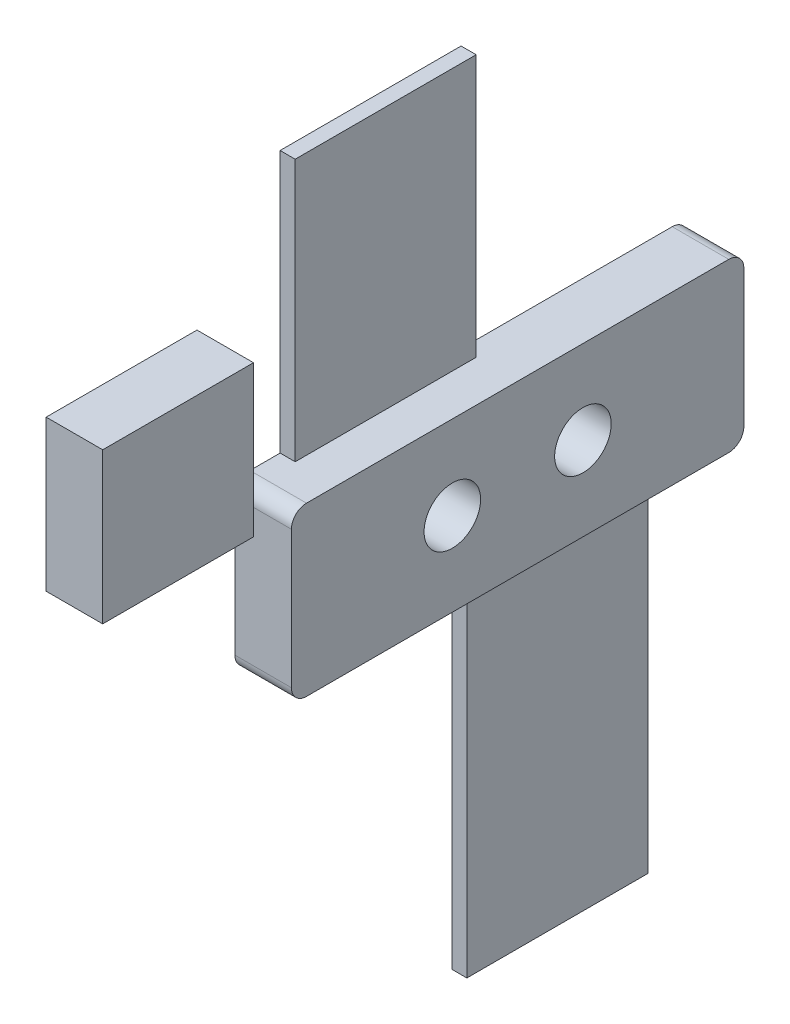
ISO-10303-21;
HEADER;
FILE_DESCRIPTION(('STEP AP214'),'2;1');
FILE_NAME('part.step','',(''),(''),'','','');
FILE_SCHEMA(('AUTOMOTIVE_DESIGN { 1 0 10303 214 1 1 1 1 }'));
ENDSEC;
DATA;
#1=APPLICATION_CONTEXT('core data for automotive mechanical design processes');
#2=APPLICATION_PROTOCOL_DEFINITION('international standard','automotive_design',2000,#1);
#3=PRODUCT_CONTEXT('',#1,'mechanical');
#4=PRODUCT('Part','Part','',(#3));
#5=PRODUCT_RELATED_PRODUCT_CATEGORY('part','',(#4));
#6=PRODUCT_DEFINITION_FORMATION('','',#4);
#7=PRODUCT_DEFINITION_CONTEXT('part definition',#1,'design');
#8=PRODUCT_DEFINITION('design','',#6,#7);
#9=PRODUCT_DEFINITION_SHAPE('','',#8);
#10=(LENGTH_UNIT() NAMED_UNIT(*) SI_UNIT(.MILLI.,.METRE.));
#11=(NAMED_UNIT(*) PLANE_ANGLE_UNIT() SI_UNIT($,.RADIAN.));
#12=(NAMED_UNIT(*) SI_UNIT($,.STERADIAN.) SOLID_ANGLE_UNIT());
#13=UNCERTAINTY_MEASURE_WITH_UNIT(LENGTH_MEASURE(1.E-05),#10,'distance_accuracy_value','');
#14=(GEOMETRIC_REPRESENTATION_CONTEXT(3) GLOBAL_UNCERTAINTY_ASSIGNED_CONTEXT((#13)) GLOBAL_UNIT_ASSIGNED_CONTEXT((#10,
#11,#12)) REPRESENTATION_CONTEXT('',''));
#15=CARTESIAN_POINT('',(0.,0.,0.));
#16=DIRECTION('',(0.,0.,1.));
#17=DIRECTION('',(1.,0.,0.));
#18=AXIS2_PLACEMENT_3D('',#15,#16,#17);
#19=CARTESIAN_POINT('',(22.7230122421383,19.5204476458362,34.9411001903851));
#20=DIRECTION('',(0.,0.,1.));
#21=DIRECTION('',(1.,0.,0.));
#22=AXIS2_PLACEMENT_3D('',#19,#20,#21);
#23=PLANE('',#22);
#24=DIRECTION('',(0.,-1.,0.));
#25=VECTOR('',#24,1.);
#26=CARTESIAN_POINT('',(4.7625,19.5204476458362,34.9411001903851));
#27=LINE('',#26,#25);
#28=CARTESIAN_POINT('',(4.7625,19.5204476458362,34.9411001903851));
#29=VERTEX_POINT('',#28);
#30=CARTESIAN_POINT('',(4.7625,6.82044764583623,34.9411001903851));
#31=VERTEX_POINT('',#30);
#32=EDGE_CURVE('E52',#29,#31,#27,.T.);
#33=ORIENTED_EDGE('',*,*,#32,.F.);
#34=DIRECTION('',(-1.,0.,0.));
#35=VECTOR('',#34,1.);
#36=CARTESIAN_POINT('',(22.7230122421383,19.5204476458362,34.9411001903851));
#37=LINE('',#36,#35);
#38=CARTESIAN_POINT('',(0.,19.5204476458362,34.9411001903851));
#39=VERTEX_POINT('',#38);
#40=EDGE_CURVE('E80',#29,#39,#37,.T.);
#41=ORIENTED_EDGE('',*,*,#40,.T.);
#42=DIRECTION('',(0.,1.,0.));
#43=VECTOR('',#42,1.);
#44=CARTESIAN_POINT('',(0.,19.5204476458362,34.9411001903851));
#45=LINE('',#44,#43);
#46=CARTESIAN_POINT('',(0.,6.82044764583623,34.9411001903851));
#47=VERTEX_POINT('',#46);
#48=EDGE_CURVE('E84',#47,#39,#45,.T.);
#49=ORIENTED_EDGE('',*,*,#48,.F.);
#50=DIRECTION('',(-1.,0.,0.));
#51=VECTOR('',#50,1.);
#52=CARTESIAN_POINT('',(22.7230122421383,6.82044764583623,34.9411001903851));
#53=LINE('',#52,#51);
#54=EDGE_CURVE('E107',#31,#47,#53,.T.);
#55=ORIENTED_EDGE('',*,*,#54,.F.);
#56=EDGE_LOOP('',(#33,#41,#49,#55));
#57=FACE_BOUND('',#56,.T.);
#58=ADVANCED_FACE('F44',(#57),#23,.T.);
#59=CARTESIAN_POINT('',(22.7230122421383,6.82044764583623,34.9411001903851));
#60=DIRECTION('',(0.,-1.,0.));
#61=DIRECTION('',(0.,0.,-1.));
#62=AXIS2_PLACEMENT_3D('',#59,#60,#61);
#63=PLANE('',#62);
#64=DIRECTION('',(0.,0.,-1.));
#65=VECTOR('',#64,1.);
#66=CARTESIAN_POINT('',(4.7625,6.82044764583623,34.9411001903851));
#67=LINE('',#66,#65);
#68=CARTESIAN_POINT('',(4.7625,6.82044764583623,22.2411001903851));
#69=VERTEX_POINT('',#68);
#70=EDGE_CURVE('E58',#31,#69,#67,.T.);
#71=ORIENTED_EDGE('',*,*,#70,.F.);
#72=ORIENTED_EDGE('',*,*,#54,.T.);
#73=DIRECTION('',(0.,0.,1.));
#74=VECTOR('',#73,1.);
#75=CARTESIAN_POINT('',(0.,6.82044764583623,34.9411001903851));
#76=LINE('',#75,#74);
#77=CARTESIAN_POINT('',(0.,6.82044764583623,22.2411001903851));
#78=VERTEX_POINT('',#77);
#79=EDGE_CURVE('E89',#78,#47,#76,.T.);
#80=ORIENTED_EDGE('',*,*,#79,.F.);
#81=DIRECTION('',(-1.,0.,0.));
#82=VECTOR('',#81,1.);
#83=CARTESIAN_POINT('',(22.7230122421383,6.82044764583623,22.2411001903851));
#84=LINE('',#83,#82);
#85=EDGE_CURVE('E110',#69,#78,#84,.T.);
#86=ORIENTED_EDGE('',*,*,#85,.F.);
#87=EDGE_LOOP('',(#71,#72,#80,#86));
#88=FACE_BOUND('',#87,.T.);
#89=ADVANCED_FACE('F116',(#88),#63,.T.);
#90=CARTESIAN_POINT('',(22.7230122421383,19.5204476458362,22.2411001903851));
#91=DIRECTION('',(0.,0.,-1.));
#92=DIRECTION('',(0.,1.,0.));
#93=AXIS2_PLACEMENT_3D('',#90,#91,#92);
#94=PLANE('',#93);
#95=DIRECTION('',(0.,1.,0.));
#96=VECTOR('',#95,1.);
#97=CARTESIAN_POINT('',(4.7625,19.5204476458362,22.2411001903851));
#98=LINE('',#97,#96);
#99=CARTESIAN_POINT('',(4.7625,19.5204476458362,22.2411001903851));
#100=VERTEX_POINT('',#99);
#101=EDGE_CURVE('E109',#69,#100,#98,.T.);
#102=ORIENTED_EDGE('',*,*,#101,.F.);
#103=ORIENTED_EDGE('',*,*,#85,.T.);
#104=DIRECTION('',(0.,-1.,0.));
#105=VECTOR('',#104,1.);
#106=CARTESIAN_POINT('',(0.,19.5204476458362,22.2411001903851));
#107=LINE('',#106,#105);
#108=CARTESIAN_POINT('',(0.,19.5204476458362,22.2411001903851));
#109=VERTEX_POINT('',#108);
#110=EDGE_CURVE('E97',#109,#78,#107,.T.);
#111=ORIENTED_EDGE('',*,*,#110,.F.);
#112=DIRECTION('',(-1.,0.,0.));
#113=VECTOR('',#112,1.);
#114=CARTESIAN_POINT('',(22.7230122421383,19.5204476458362,22.2411001903851));
#115=LINE('',#114,#113);
#116=EDGE_CURVE('E88',#100,#109,#115,.T.);
#117=ORIENTED_EDGE('',*,*,#116,.F.);
#118=EDGE_LOOP('',(#102,#103,#111,#117));
#119=FACE_BOUND('',#118,.T.);
#120=ADVANCED_FACE('F114',(#119),#94,.T.);
#121=CARTESIAN_POINT('',(22.7230122421383,19.5204476458362,34.9411001903851));
#122=DIRECTION('',(0.,1.,0.));
#123=DIRECTION('',(0.,0.,1.));
#124=AXIS2_PLACEMENT_3D('',#121,#122,#123);
#125=PLANE('',#124);
#126=DIRECTION('',(0.,0.,1.));
#127=VECTOR('',#126,1.);
#128=CARTESIAN_POINT('',(4.7625,19.5204476458362,34.9411001903851));
#129=LINE('',#128,#127);
#130=EDGE_CURVE('E12',#100,#29,#129,.T.);
#131=ORIENTED_EDGE('',*,*,#130,.F.);
#132=ORIENTED_EDGE('',*,*,#116,.T.);
#133=DIRECTION('',(0.,0.,-1.));
#134=VECTOR('',#133,1.);
#135=CARTESIAN_POINT('',(0.,19.5204476458362,34.9411001903851));
#136=LINE('',#135,#134);
#137=EDGE_CURVE('E91',#39,#109,#136,.T.);
#138=ORIENTED_EDGE('',*,*,#137,.F.);
#139=ORIENTED_EDGE('',*,*,#40,.F.);
#140=EDGE_LOOP('',(#131,#132,#138,#139));
#141=FACE_BOUND('',#140,.T.);
#142=ADVANCED_FACE('F92',(#141),#125,.T.);
#143=CARTESIAN_POINT('',(0.,0.,0.));
#144=DIRECTION('',(1.,0.,0.));
#145=DIRECTION('',(0.,0.,-1.));
#146=AXIS2_PLACEMENT_3D('',#143,#144,#145);
#147=PLANE('',#146);
#148=ORIENTED_EDGE('',*,*,#48,.T.);
#149=ORIENTED_EDGE('',*,*,#137,.T.);
#150=ORIENTED_EDGE('',*,*,#110,.T.);
#151=ORIENTED_EDGE('',*,*,#79,.T.);
#152=EDGE_LOOP('',(#148,#149,#150,#151));
#153=FACE_BOUND('',#152,.T.);
#154=ADVANCED_FACE('F99',(#153),#147,.F.);
#155=CARTESIAN_POINT('',(4.7625,0.,0.));
#156=DIRECTION('',(-1.,0.,0.));
#157=DIRECTION('',(0.,0.,1.));
#158=AXIS2_PLACEMENT_3D('',#155,#156,#157);
#159=PLANE('',#158);
#160=ORIENTED_EDGE('',*,*,#32,.T.);
#161=ORIENTED_EDGE('',*,*,#70,.T.);
#162=ORIENTED_EDGE('',*,*,#101,.T.);
#163=ORIENTED_EDGE('',*,*,#130,.T.);
#164=EDGE_LOOP('',(#160,#161,#162,#163));
#165=FACE_BOUND('',#164,.T.);
#166=ADVANCED_FACE('F118',(#165),#159,.F.);
#167=CLOSED_SHELL('',(#58,#89,#120,#142,#154,#166));
#168=MANIFOLD_SOLID_BREP('B2',#167);
#169=CARTESIAN_POINT('',(4.7625,-7.0485,19.05));
#170=DIRECTION('',(0.,0.,-1.));
#171=DIRECTION('',(-1.,0.,0.));
#172=AXIS2_PLACEMENT_3D('',#169,#170,#171);
#173=PLANE('',#172);
#174=DIRECTION('',(0.,-1.,0.));
#175=VECTOR('',#174,1.);
#176=CARTESIAN_POINT('',(4.7625,-7.0485,19.05));
#177=LINE('',#176,#175);
#178=CARTESIAN_POINT('',(4.7625,5.7785,19.05));
#179=VERTEX_POINT('',#178);
#180=CARTESIAN_POINT('',(4.7625,-5.7785,19.05));
#181=VERTEX_POINT('',#180);
#182=EDGE_CURVE('E355',#179,#181,#177,.T.);
#183=ORIENTED_EDGE('',*,*,#182,.F.);
#184=DIRECTION('',(-1.,0.,0.));
#185=VECTOR('',#184,1.);
#186=CARTESIAN_POINT('',(4.7625,5.7785,19.05));
#187=LINE('',#186,#185);
#188=CARTESIAN_POINT('',(0.,5.7785,19.05));
#189=VERTEX_POINT('',#188);
#190=EDGE_CURVE('E380',#179,#189,#187,.T.);
#191=ORIENTED_EDGE('',*,*,#190,.T.);
#192=DIRECTION('',(0.,-1.,0.));
#193=VECTOR('',#192,1.);
#194=CARTESIAN_POINT('',(0.,-7.0485,19.05));
#195=LINE('',#194,#193);
#196=CARTESIAN_POINT('',(0.,-5.7785,19.05));
#197=VERTEX_POINT('',#196);
#198=EDGE_CURVE('E350',#189,#197,#195,.T.);
#199=ORIENTED_EDGE('',*,*,#198,.T.);
#200=DIRECTION('',(-1.,0.,0.));
#201=VECTOR('',#200,1.);
#202=CARTESIAN_POINT('',(4.7625,-5.7785,19.05));
#203=LINE('',#202,#201);
#204=EDGE_CURVE('E368',#197,#181,#203,.F.);
#205=ORIENTED_EDGE('',*,*,#204,.T.);
#206=EDGE_LOOP('',(#183,#191,#199,#205));
#207=FACE_BOUND('',#206,.T.);
#208=ADVANCED_FACE('F167',(#207),#173,.F.);
#209=CARTESIAN_POINT('',(4.7625,-7.0485,19.05));
#210=DIRECTION('',(0.,1.,0.));
#211=DIRECTION('',(0.,0.,1.));
#212=AXIS2_PLACEMENT_3D('',#209,#210,#211);
#213=PLANE('',#212);
#214=DIRECTION('',(0.,0.,-1.));
#215=VECTOR('',#214,1.);
#216=CARTESIAN_POINT('',(0.,-7.0485,19.05));
#217=LINE('',#216,#215);
#218=CARTESIAN_POINT('',(0.,-7.0485,17.78));
#219=VERTEX_POINT('',#218);
#220=CARTESIAN_POINT('',(0.,-7.0485,0.78331789402027));
#221=VERTEX_POINT('',#220);
#222=EDGE_CURVE('E372',#219,#221,#217,.T.);
#223=ORIENTED_EDGE('',*,*,#222,.T.);
#224=DIRECTION('',(-1.,0.,0.));
#225=VECTOR('',#224,1.);
#226=CARTESIAN_POINT('',(1.27,-7.0485,0.783317894020271));
#227=LINE('',#226,#225);
#228=CARTESIAN_POINT('',(1.27,-7.0485,0.783317894020277));
#229=VERTEX_POINT('',#228);
#230=EDGE_CURVE('E187',#229,#221,#227,.T.);
#231=ORIENTED_EDGE('',*,*,#230,.F.);
#232=DIRECTION('',(0.,0.,-1.));
#233=VECTOR('',#232,1.);
#234=CARTESIAN_POINT('',(1.27,-7.0485,0.783317894020271));
#235=LINE('',#234,#233);
#236=CARTESIAN_POINT('',(1.27,-7.0485,-14.4566821059797));
#237=VERTEX_POINT('',#236);
#238=EDGE_CURVE('E182',#229,#237,#235,.T.);
#239=ORIENTED_EDGE('',*,*,#238,.T.);
#240=DIRECTION('',(-1.,0.,0.));
#241=VECTOR('',#240,1.);
#242=CARTESIAN_POINT('',(1.27,-7.0485,-14.4566821059797));
#243=LINE('',#242,#241);
#244=CARTESIAN_POINT('',(0.,-7.0485,-14.4566821059797));
#245=VERTEX_POINT('',#244);
#246=EDGE_CURVE('E289',#237,#245,#243,.T.);
#247=ORIENTED_EDGE('',*,*,#246,.T.);
#248=CARTESIAN_POINT('',(0.,-7.0485,-17.78));
#249=VERTEX_POINT('',#248);
#250=EDGE_CURVE('E371',#245,#249,#217,.T.);
#251=ORIENTED_EDGE('',*,*,#250,.T.);
#252=DIRECTION('',(-1.,0.,0.));
#253=VECTOR('',#252,1.);
#254=CARTESIAN_POINT('',(4.7625,-7.0485,-17.78));
#255=LINE('',#254,#253);
#256=CARTESIAN_POINT('',(4.7625,-7.0485,-17.78));
#257=VERTEX_POINT('',#256);
#258=EDGE_CURVE('E42',#249,#257,#255,.F.);
#259=ORIENTED_EDGE('',*,*,#258,.T.);
#260=DIRECTION('',(0.,0.,-1.));
#261=VECTOR('',#260,1.);
#262=CARTESIAN_POINT('',(4.7625,-7.0485,19.05));
#263=LINE('',#262,#261);
#264=CARTESIAN_POINT('',(4.7625,-7.0485,17.78));
#265=VERTEX_POINT('',#264);
#266=EDGE_CURVE('E358',#265,#257,#263,.T.);
#267=ORIENTED_EDGE('',*,*,#266,.F.);
#268=DIRECTION('',(-1.,0.,0.));
#269=VECTOR('',#268,1.);
#270=CARTESIAN_POINT('',(4.7625,-7.0485,17.78));
#271=LINE('',#270,#269);
#272=EDGE_CURVE('E175',#265,#219,#271,.T.);
#273=ORIENTED_EDGE('',*,*,#272,.T.);
#274=EDGE_LOOP('',(#223,#231,#239,#247,#251,#259,#267,#273));
#275=FACE_BOUND('',#274,.T.);
#276=ADVANCED_FACE('F414',(#275),#213,.F.);
#277=CARTESIAN_POINT('',(4.7625,-7.0485,-19.05));
#278=DIRECTION('',(0.,0.,1.));
#279=DIRECTION('',(1.,0.,0.));
#280=AXIS2_PLACEMENT_3D('',#277,#278,#279);
#281=PLANE('',#280);
#282=DIRECTION('',(0.,1.,0.));
#283=VECTOR('',#282,1.);
#284=CARTESIAN_POINT('',(0.,-7.0485,-19.05));
#285=LINE('',#284,#283);
#286=CARTESIAN_POINT('',(0.,-5.7785,-19.05));
#287=VERTEX_POINT('',#286);
#288=CARTESIAN_POINT('',(0.,5.7785,-19.05));
#289=VERTEX_POINT('',#288);
#290=EDGE_CURVE('E374',#287,#289,#285,.T.);
#291=ORIENTED_EDGE('',*,*,#290,.T.);
#292=DIRECTION('',(-1.,0.,0.));
#293=VECTOR('',#292,1.);
#294=CARTESIAN_POINT('',(4.7625,5.7785,-19.05));
#295=LINE('',#294,#293);
#296=CARTESIAN_POINT('',(4.7625,5.7785,-19.05));
#297=VERTEX_POINT('',#296);
#298=EDGE_CURVE('E409',#289,#297,#295,.F.);
#299=ORIENTED_EDGE('',*,*,#298,.T.);
#300=DIRECTION('',(0.,1.,0.));
#301=VECTOR('',#300,1.);
#302=CARTESIAN_POINT('',(4.7625,-7.0485,-19.05));
#303=LINE('',#302,#301);
#304=CARTESIAN_POINT('',(4.7625,-5.7785,-19.05));
#305=VERTEX_POINT('',#304);
#306=EDGE_CURVE('E362',#305,#297,#303,.T.);
#307=ORIENTED_EDGE('',*,*,#306,.F.);
#308=DIRECTION('',(-1.,0.,0.));
#309=VECTOR('',#308,1.);
#310=CARTESIAN_POINT('',(4.7625,-5.7785,-19.05));
#311=LINE('',#310,#309);
#312=EDGE_CURVE('E406',#305,#287,#311,.T.);
#313=ORIENTED_EDGE('',*,*,#312,.T.);
#314=EDGE_LOOP('',(#291,#299,#307,#313));
#315=FACE_BOUND('',#314,.T.);
#316=ADVANCED_FACE('F442',(#315),#281,.F.);
#317=CARTESIAN_POINT('',(4.7625,7.0485,19.05));
#318=DIRECTION('',(0.,-1.,0.));
#319=DIRECTION('',(0.,0.,-1.));
#320=AXIS2_PLACEMENT_3D('',#317,#318,#319);
#321=PLANE('',#320);
#322=DIRECTION('',(0.,0.,1.));
#323=VECTOR('',#322,1.);
#324=CARTESIAN_POINT('',(1.27,7.0485,15.24));
#325=LINE('',#324,#323);
#326=CARTESIAN_POINT('',(1.27,7.0485,0.));
#327=VERTEX_POINT('',#326);
#328=CARTESIAN_POINT('',(1.27,7.0485,15.24));
#329=VERTEX_POINT('',#328);
#330=EDGE_CURVE('E323',#327,#329,#325,.T.);
#331=ORIENTED_EDGE('',*,*,#330,.T.);
#332=DIRECTION('',(-1.,0.,0.));
#333=VECTOR('',#332,1.);
#334=CARTESIAN_POINT('',(1.27,7.0485,15.24));
#335=LINE('',#334,#333);
#336=CARTESIAN_POINT('',(0.,7.0485,15.24));
#337=VERTEX_POINT('',#336);
#338=EDGE_CURVE('E333',#329,#337,#335,.T.);
#339=ORIENTED_EDGE('',*,*,#338,.T.);
#340=DIRECTION('',(0.,0.,1.));
#341=VECTOR('',#340,1.);
#342=CARTESIAN_POINT('',(0.,7.0485,19.05));
#343=LINE('',#342,#341);
#344=CARTESIAN_POINT('',(0.,7.0485,17.78));
#345=VERTEX_POINT('',#344);
#346=EDGE_CURVE('E377',#337,#345,#343,.T.);
#347=ORIENTED_EDGE('',*,*,#346,.T.);
#348=DIRECTION('',(-1.,0.,0.));
#349=VECTOR('',#348,1.);
#350=CARTESIAN_POINT('',(4.7625,7.0485,17.78));
#351=LINE('',#350,#349);
#352=CARTESIAN_POINT('',(4.7625,7.0485,17.78));
#353=VERTEX_POINT('',#352);
#354=EDGE_CURVE('E396',#345,#353,#351,.F.);
#355=ORIENTED_EDGE('',*,*,#354,.T.);
#356=DIRECTION('',(0.,0.,1.));
#357=VECTOR('',#356,1.);
#358=CARTESIAN_POINT('',(4.7625,7.0485,19.05));
#359=LINE('',#358,#357);
#360=CARTESIAN_POINT('',(4.7625,7.0485,-17.78));
#361=VERTEX_POINT('',#360);
#362=EDGE_CURVE('E365',#361,#353,#359,.T.);
#363=ORIENTED_EDGE('',*,*,#362,.F.);
#364=DIRECTION('',(-1.,0.,0.));
#365=VECTOR('',#364,1.);
#366=CARTESIAN_POINT('',(4.7625,7.0485,-17.78));
#367=LINE('',#366,#365);
#368=CARTESIAN_POINT('',(0.,7.0485,-17.78));
#369=VERTEX_POINT('',#368);
#370=EDGE_CURVE('E393',#361,#369,#367,.T.);
#371=ORIENTED_EDGE('',*,*,#370,.T.);
#372=CARTESIAN_POINT('',(0.,7.0485,0.));
#373=VERTEX_POINT('',#372);
#374=EDGE_CURVE('E359',#369,#373,#343,.T.);
#375=ORIENTED_EDGE('',*,*,#374,.T.);
#376=DIRECTION('',(-1.,0.,0.));
#377=VECTOR('',#376,1.);
#378=CARTESIAN_POINT('',(1.27,7.0485,0.));
#379=LINE('',#378,#377);
#380=EDGE_CURVE('E337',#327,#373,#379,.T.);
#381=ORIENTED_EDGE('',*,*,#380,.F.);
#382=EDGE_LOOP('',(#331,#339,#347,#355,#363,#371,#375,#381));
#383=FACE_BOUND('',#382,.T.);
#384=ADVANCED_FACE('F475',(#383),#321,.F.);
#385=CARTESIAN_POINT('',(4.7625,0.,0.));
#386=DIRECTION('',(-1.,0.,0.));
#387=DIRECTION('',(0.,0.,1.));
#388=AXIS2_PLACEMENT_3D('',#385,#386,#387);
#389=PLANE('',#388);
#390=CARTESIAN_POINT('',(4.7625,0.,5.4991));
#391=DIRECTION('',(1.,0.,0.));
#392=DIRECTION('',(0.,0.,-1.));
#393=AXIS2_PLACEMENT_3D('',#390,#391,#392);
#394=CIRCLE('',#393,2.38125);
#395=CARTESIAN_POINT('',(4.7625,0.,3.11785));
#396=VERTEX_POINT('',#395);
#397=EDGE_CURVE('E343',#396,#396,#394,.T.);
#398=ORIENTED_EDGE('',*,*,#397,.F.);
#399=EDGE_LOOP('',(#398));
#400=FACE_BOUND('',#399,.T.);
#401=CARTESIAN_POINT('',(4.7625,0.,-5.4991));
#402=DIRECTION('',(1.,0.,0.));
#403=DIRECTION('',(0.,0.,-1.));
#404=AXIS2_PLACEMENT_3D('',#401,#402,#403);
#405=CIRCLE('',#404,2.38125);
#406=CARTESIAN_POINT('',(4.7625,0.,-7.88035));
#407=VERTEX_POINT('',#406);
#408=EDGE_CURVE('E336',#407,#407,#405,.T.);
#409=ORIENTED_EDGE('',*,*,#408,.F.);
#410=EDGE_LOOP('',(#409));
#411=FACE_BOUND('',#410,.T.);
#412=ORIENTED_EDGE('',*,*,#362,.T.);
#413=CARTESIAN_POINT('',(4.7625,5.7785,17.78));
#414=DIRECTION('',(-1.,0.,0.));
#415=DIRECTION('',(0.,0.,1.));
#416=AXIS2_PLACEMENT_3D('',#413,#414,#415);
#417=CIRCLE('',#416,1.27);
#418=EDGE_CURVE('E404',#353,#179,#417,.F.);
#419=ORIENTED_EDGE('',*,*,#418,.T.);
#420=ORIENTED_EDGE('',*,*,#182,.T.);
#421=CARTESIAN_POINT('',(4.7625,-5.7785,17.78));
#422=DIRECTION('',(-1.,0.,0.));
#423=DIRECTION('',(0.,0.,1.));
#424=AXIS2_PLACEMENT_3D('',#421,#422,#423);
#425=CIRCLE('',#424,1.27);
#426=EDGE_CURVE('E398',#181,#265,#425,.F.);
#427=ORIENTED_EDGE('',*,*,#426,.T.);
#428=ORIENTED_EDGE('',*,*,#266,.T.);
#429=CARTESIAN_POINT('',(4.7625,-5.7785,-17.78));
#430=DIRECTION('',(-1.,0.,0.));
#431=DIRECTION('',(0.,0.,1.));
#432=AXIS2_PLACEMENT_3D('',#429,#430,#431);
#433=CIRCLE('',#432,1.27);
#434=EDGE_CURVE('E400',#257,#305,#433,.F.);
#435=ORIENTED_EDGE('',*,*,#434,.T.);
#436=ORIENTED_EDGE('',*,*,#306,.T.);
#437=CARTESIAN_POINT('',(4.7625,5.7785,-17.78));
#438=DIRECTION('',(-1.,0.,0.));
#439=DIRECTION('',(0.,0.,1.));
#440=AXIS2_PLACEMENT_3D('',#437,#438,#439);
#441=CIRCLE('',#440,1.27);
#442=EDGE_CURVE('E402',#297,#361,#441,.F.);
#443=ORIENTED_EDGE('',*,*,#442,.T.);
#444=EDGE_LOOP('',(#412,#419,#420,#427,#428,#435,#436,#443));
#445=FACE_BOUND('',#444,.T.);
#446=ADVANCED_FACE('F466',(#400,#411,#445),#389,.F.);
#447=CARTESIAN_POINT('',(0.,0.,0.));
#448=DIRECTION('',(-1.,0.,0.));
#449=DIRECTION('',(0.,0.,1.));
#450=AXIS2_PLACEMENT_3D('',#447,#448,#449);
#451=PLANE('',#450);
#452=CARTESIAN_POINT('',(0.,0.,5.4991));
#453=DIRECTION('',(-1.,0.,0.));
#454=DIRECTION('',(0.,0.,1.));
#455=AXIS2_PLACEMENT_3D('',#452,#453,#454);
#456=CIRCLE('',#455,2.38125);
#457=CARTESIAN_POINT('',(0.,0.,3.11785));
#458=VERTEX_POINT('',#457);
#459=EDGE_CURVE('E346',#458,#458,#456,.F.);
#460=ORIENTED_EDGE('',*,*,#459,.T.);
#461=EDGE_LOOP('',(#460));
#462=FACE_BOUND('',#461,.T.);
#463=CARTESIAN_POINT('',(0.,0.,-5.4991));
#464=DIRECTION('',(-1.,0.,0.));
#465=DIRECTION('',(0.,0.,1.));
#466=AXIS2_PLACEMENT_3D('',#463,#464,#465);
#467=CIRCLE('',#466,2.38125);
#468=CARTESIAN_POINT('',(0.,0.,-7.88035));
#469=VERTEX_POINT('',#468);
#470=EDGE_CURVE('E347',#469,#469,#467,.F.);
#471=ORIENTED_EDGE('',*,*,#470,.T.);
#472=EDGE_LOOP('',(#471));
#473=FACE_BOUND('',#472,.T.);
#474=ORIENTED_EDGE('',*,*,#198,.F.);
#475=CARTESIAN_POINT('',(0.,5.7785,17.78));
#476=DIRECTION('',(-1.,0.,0.));
#477=DIRECTION('',(0.,0.,1.));
#478=AXIS2_PLACEMENT_3D('',#475,#476,#477);
#479=CIRCLE('',#478,1.27);
#480=EDGE_CURVE('E390',#189,#345,#479,.T.);
#481=ORIENTED_EDGE('',*,*,#480,.T.);
#482=ORIENTED_EDGE('',*,*,#346,.F.);
#483=DIRECTION('',(0.,1.,0.));
#484=VECTOR('',#483,1.);
#485=CARTESIAN_POINT('',(0.,7.0485,15.24));
#486=LINE('',#485,#484);
#487=CARTESIAN_POINT('',(0.,29.1155886105798,15.24));
#488=VERTEX_POINT('',#487);
#489=EDGE_CURVE('E310',#337,#488,#486,.T.);
#490=ORIENTED_EDGE('',*,*,#489,.T.);
#491=DIRECTION('',(0.,0.,-1.));
#492=VECTOR('',#491,1.);
#493=CARTESIAN_POINT('',(0.,29.1155886105798,15.24));
#494=LINE('',#493,#492);
#495=CARTESIAN_POINT('',(0.,29.1155886105798,0.));
#496=VERTEX_POINT('',#495);
#497=EDGE_CURVE('E328',#488,#496,#494,.T.);
#498=ORIENTED_EDGE('',*,*,#497,.T.);
#499=DIRECTION('',(0.,-1.,0.));
#500=VECTOR('',#499,1.);
#501=CARTESIAN_POINT('',(0.,7.0485,0.));
#502=LINE('',#501,#500);
#503=EDGE_CURVE('E317',#496,#373,#502,.T.);
#504=ORIENTED_EDGE('',*,*,#503,.T.);
#505=ORIENTED_EDGE('',*,*,#374,.F.);
#506=CARTESIAN_POINT('',(0.,5.7785,-17.78));
#507=DIRECTION('',(-1.,0.,0.));
#508=DIRECTION('',(0.,0.,1.));
#509=AXIS2_PLACEMENT_3D('',#506,#507,#508);
#510=CIRCLE('',#509,1.27);
#511=EDGE_CURVE('E388',#369,#289,#510,.T.);
#512=ORIENTED_EDGE('',*,*,#511,.T.);
#513=ORIENTED_EDGE('',*,*,#290,.F.);
#514=CARTESIAN_POINT('',(0.,-5.7785,-17.78));
#515=DIRECTION('',(-1.,0.,0.));
#516=DIRECTION('',(0.,0.,1.));
#517=AXIS2_PLACEMENT_3D('',#514,#515,#516);
#518=CIRCLE('',#517,1.27);
#519=EDGE_CURVE('E385',#287,#249,#518,.T.);
#520=ORIENTED_EDGE('',*,*,#519,.T.);
#521=ORIENTED_EDGE('',*,*,#250,.F.);
#522=DIRECTION('',(0.,-1.,0.));
#523=VECTOR('',#522,1.);
#524=CARTESIAN_POINT('',(0.,-7.0485,-14.4566821059797));
#525=LINE('',#524,#523);
#526=CARTESIAN_POINT('',(0.,-37.8281386224444,-14.4566821059797));
#527=VERTEX_POINT('',#526);
#528=EDGE_CURVE('E307',#245,#527,#525,.T.);
#529=ORIENTED_EDGE('',*,*,#528,.T.);
#530=DIRECTION('',(0.,0.,1.));
#531=VECTOR('',#530,1.);
#532=CARTESIAN_POINT('',(0.,-37.8281386224444,0.783317894020277));
#533=LINE('',#532,#531);
#534=CARTESIAN_POINT('',(0.,-37.8281386224444,0.783317894020277));
#535=VERTEX_POINT('',#534);
#536=EDGE_CURVE('E284',#527,#535,#533,.T.);
#537=ORIENTED_EDGE('',*,*,#536,.T.);
#538=DIRECTION('',(0.,1.,0.));
#539=VECTOR('',#538,1.);
#540=CARTESIAN_POINT('',(0.,-7.0485,0.783317894020271));
#541=LINE('',#540,#539);
#542=EDGE_CURVE('E304',#535,#221,#541,.T.);
#543=ORIENTED_EDGE('',*,*,#542,.T.);
#544=ORIENTED_EDGE('',*,*,#222,.F.);
#545=CARTESIAN_POINT('',(0.,-5.7785,17.78));
#546=DIRECTION('',(-1.,0.,0.));
#547=DIRECTION('',(0.,0.,1.));
#548=AXIS2_PLACEMENT_3D('',#545,#546,#547);
#549=CIRCLE('',#548,1.27);
#550=EDGE_CURVE('E383',#219,#197,#549,.T.);
#551=ORIENTED_EDGE('',*,*,#550,.T.);
#552=EDGE_LOOP('',(#474,#481,#482,#490,#498,#504,#505,#512,#513,#520,#521,#529,#537,#543,#544,#551));
#553=FACE_BOUND('',#552,.T.);
#554=ADVANCED_FACE('F419',(#462,#473,#553),#451,.T.);
#555=CARTESIAN_POINT('',(4.7625,5.7785,17.78));
#556=DIRECTION('',(-1.,0.,0.));
#557=DIRECTION('',(0.,0.,1.));
#558=AXIS2_PLACEMENT_3D('',#555,#556,#557);
#559=CYLINDRICAL_SURFACE('',#558,1.27);
#560=ORIENTED_EDGE('',*,*,#418,.F.);
#561=ORIENTED_EDGE('',*,*,#354,.F.);
#562=ORIENTED_EDGE('',*,*,#480,.F.);
#563=ORIENTED_EDGE('',*,*,#190,.F.);
#564=EDGE_LOOP('',(#560,#561,#562,#563));
#565=FACE_BOUND('',#564,.T.);
#566=ADVANCED_FACE('F447',(#565),#559,.T.);
#567=CARTESIAN_POINT('',(4.7625,5.7785,-17.78));
#568=DIRECTION('',(-1.,0.,0.));
#569=DIRECTION('',(0.,0.,1.));
#570=AXIS2_PLACEMENT_3D('',#567,#568,#569);
#571=CYLINDRICAL_SURFACE('',#570,1.27);
#572=ORIENTED_EDGE('',*,*,#442,.F.);
#573=ORIENTED_EDGE('',*,*,#298,.F.);
#574=ORIENTED_EDGE('',*,*,#511,.F.);
#575=ORIENTED_EDGE('',*,*,#370,.F.);
#576=EDGE_LOOP('',(#572,#573,#574,#575));
#577=FACE_BOUND('',#576,.T.);
#578=ADVANCED_FACE('F450',(#577),#571,.T.);
#579=CARTESIAN_POINT('',(4.7625,-5.7785,-17.78));
#580=DIRECTION('',(-1.,0.,0.));
#581=DIRECTION('',(0.,0.,1.));
#582=AXIS2_PLACEMENT_3D('',#579,#580,#581);
#583=CYLINDRICAL_SURFACE('',#582,1.27);
#584=ORIENTED_EDGE('',*,*,#434,.F.);
#585=ORIENTED_EDGE('',*,*,#258,.F.);
#586=ORIENTED_EDGE('',*,*,#519,.F.);
#587=ORIENTED_EDGE('',*,*,#312,.F.);
#588=EDGE_LOOP('',(#584,#585,#586,#587));
#589=FACE_BOUND('',#588,.T.);
#590=ADVANCED_FACE('F453',(#589),#583,.T.);
#591=CARTESIAN_POINT('',(4.7625,-5.7785,17.78));
#592=DIRECTION('',(-1.,0.,0.));
#593=DIRECTION('',(0.,0.,1.));
#594=AXIS2_PLACEMENT_3D('',#591,#592,#593);
#595=CYLINDRICAL_SURFACE('',#594,1.27);
#596=ORIENTED_EDGE('',*,*,#426,.F.);
#597=ORIENTED_EDGE('',*,*,#204,.F.);
#598=ORIENTED_EDGE('',*,*,#550,.F.);
#599=ORIENTED_EDGE('',*,*,#272,.F.);
#600=EDGE_LOOP('',(#596,#597,#598,#599));
#601=FACE_BOUND('',#600,.T.);
#602=ADVANCED_FACE('F169',(#601),#595,.T.);
#603=CARTESIAN_POINT('',(-6.73519209080187,0.,-5.4991));
#604=DIRECTION('',(1.,0.,0.));
#605=DIRECTION('',(0.,0.,-1.));
#606=AXIS2_PLACEMENT_3D('',#603,#604,#605);
#607=CYLINDRICAL_SURFACE('',#606,2.38125);
#608=CARTESIAN_POINT('',(4.7625,0.,-7.88035));
#609=CARTESIAN_POINT('',(4.712890625,0.,-7.88035));
#610=CARTESIAN_POINT('',(4.66328125,0.,-7.88035));
#611=CARTESIAN_POINT('',(4.5640625,0.,-7.88035));
#612=CARTESIAN_POINT('',(4.514453125,0.,-7.88035));
#613=CARTESIAN_POINT('',(4.415234375,0.,-7.88035));
#614=CARTESIAN_POINT('',(4.365625,0.,-7.88035));
#615=CARTESIAN_POINT('',(4.26640625,0.,-7.88035));
#616=CARTESIAN_POINT('',(4.216796875,0.,-7.88035));
#617=CARTESIAN_POINT('',(4.117578125,0.,-7.88035));
#618=CARTESIAN_POINT('',(4.06796875,0.,-7.88035));
#619=CARTESIAN_POINT('',(3.96875,0.,-7.88035));
#620=CARTESIAN_POINT('',(3.919140625,0.,-7.88035));
#621=CARTESIAN_POINT('',(3.819921875,0.,-7.88035));
#622=CARTESIAN_POINT('',(3.7703125,0.,-7.88035));
#623=CARTESIAN_POINT('',(3.67109375,0.,-7.88035));
#624=CARTESIAN_POINT('',(3.621484375,0.,-7.88035));
#625=CARTESIAN_POINT('',(3.522265625,0.,-7.88035));
#626=CARTESIAN_POINT('',(3.47265625,0.,-7.88035));
#627=CARTESIAN_POINT('',(3.3734375,0.,-7.88035));
#628=CARTESIAN_POINT('',(3.323828125,0.,-7.88035));
#629=CARTESIAN_POINT('',(3.224609375,0.,-7.88035));
#630=CARTESIAN_POINT('',(3.175,0.,-7.88035));
#631=CARTESIAN_POINT('',(3.07578125,0.,-7.88035));
#632=CARTESIAN_POINT('',(3.026171875,0.,-7.88035));
#633=CARTESIAN_POINT('',(2.926953125,0.,-7.88035));
#634=CARTESIAN_POINT('',(2.87734375,0.,-7.88035));
#635=CARTESIAN_POINT('',(2.778125,0.,-7.88035));
#636=CARTESIAN_POINT('',(2.728515625,0.,-7.88035));
#637=CARTESIAN_POINT('',(2.629296875,0.,-7.88035));
#638=CARTESIAN_POINT('',(2.5796875,0.,-7.88035));
#639=CARTESIAN_POINT('',(2.48046875,0.,-7.88035));
#640=CARTESIAN_POINT('',(2.430859375,0.,-7.88035));
#641=CARTESIAN_POINT('',(2.331640625,0.,-7.88035));
#642=CARTESIAN_POINT('',(2.28203125,0.,-7.88035));
#643=CARTESIAN_POINT('',(2.1828125,0.,-7.88035));
#644=CARTESIAN_POINT('',(2.133203125,0.,-7.88035));
#645=CARTESIAN_POINT('',(2.033984375,0.,-7.88035));
#646=CARTESIAN_POINT('',(1.984375,0.,-7.88035));
#647=CARTESIAN_POINT('',(1.88515625,0.,-7.88035));
#648=CARTESIAN_POINT('',(1.835546875,0.,-7.88035));
#649=CARTESIAN_POINT('',(1.736328125,0.,-7.88035));
#650=CARTESIAN_POINT('',(1.68671875,0.,-7.88035));
#651=CARTESIAN_POINT('',(1.5875,0.,-7.88035));
#652=CARTESIAN_POINT('',(1.537890625,0.,-7.88035));
#653=CARTESIAN_POINT('',(1.438671875,0.,-7.88035));
#654=CARTESIAN_POINT('',(1.3890625,0.,-7.88035));
#655=CARTESIAN_POINT('',(1.28984375,0.,-7.88035));
#656=CARTESIAN_POINT('',(1.240234375,0.,-7.88035));
#657=CARTESIAN_POINT('',(1.141015625,0.,-7.88035));
#658=CARTESIAN_POINT('',(1.09140625,0.,-7.88035));
#659=CARTESIAN_POINT('',(0.9921875,0.,-7.88035));
#660=CARTESIAN_POINT('',(0.942578125,0.,-7.88035));
#661=CARTESIAN_POINT('',(0.843359375,0.,-7.88035));
#662=CARTESIAN_POINT('',(0.79375,0.,-7.88035));
#663=CARTESIAN_POINT('',(0.69453125,0.,-7.88035));
#664=CARTESIAN_POINT('',(0.644921875,0.,-7.88035));
#665=CARTESIAN_POINT('',(0.545703125,0.,-7.88035));
#666=CARTESIAN_POINT('',(0.49609375,0.,-7.88035));
#667=CARTESIAN_POINT('',(0.396875,0.,-7.88035));
#668=CARTESIAN_POINT('',(0.347265625,0.,-7.88035));
#669=CARTESIAN_POINT('',(0.248046875,0.,-7.88035));
#670=CARTESIAN_POINT('',(0.1984375,0.,-7.88035));
#671=CARTESIAN_POINT('',(0.09921875,0.,-7.88035));
#672=CARTESIAN_POINT('',(0.049609375,0.,-7.88035));
#673=CARTESIAN_POINT('',(0.,0.,-7.88035));
#674=B_SPLINE_CURVE_WITH_KNOTS('',3,(#608,#609,#610,#611,#612,#613,#614,#615,#616,#617,#618,
#619,#620,#621,#622,#623,#624,#625,#626,#627,#628,#629,#630,#631,#632,#633,#634,#635,#636,#637,
#638,#639,#640,#641,#642,#643,#644,#645,#646,#647,#648,#649,#650,#651,#652,#653,#654,#655,#656,
#657,#658,#659,#660,#661,#662,#663,#664,#665,#666,#667,#668,#669,#670,#671,#672,#673),
.UNSPECIFIED.,.F.,.F.,(4,2,2,2,2,2,2,2,2,2,2,2,2,2,2,2,2,2,2,2,2,2,2,2,2,2,2,2,2,2,2,2,4),(0.,
0.148828125,0.29765625,0.446484375,0.5953125,0.744140625,0.892968750000001,1.041796875,1.190625,
1.339453125,1.48828125,1.637109375,1.7859375,1.934765625,2.08359375,2.232421875,2.38125,
2.530078125,2.67890625,2.827734375,2.9765625,3.125390625,3.27421875,3.423046875,3.571875,
3.720703125,3.86953125,4.018359375,4.1671875,4.316015625,4.46484375,4.613671875,4.7625),.UNSPECIFIED.);
#675=EDGE_CURVE('BSEAM460',#407,#469,#674,.T.);
#676=ORIENTED_EDGE('',*,*,#408,.T.);
#677=ORIENTED_EDGE('',*,*,#470,.F.);
#678=ORIENTED_EDGE('',*,*,#675,.T.);
#679=ORIENTED_EDGE('',*,*,#675,.F.);
#680=EDGE_LOOP('',(#676,#678,#677,#679));
#681=FACE_BOUND('',#680,.T.);
#682=ADVANCED_FACE('F460',(#681),#607,.F.);
#683=CARTESIAN_POINT('',(-6.73519209080187,0.,5.4991));
#684=DIRECTION('',(1.,0.,0.));
#685=DIRECTION('',(0.,0.,-1.));
#686=AXIS2_PLACEMENT_3D('',#683,#684,#685);
#687=CYLINDRICAL_SURFACE('',#686,2.38125);
#688=CARTESIAN_POINT('',(4.7625,0.,3.11785));
#689=CARTESIAN_POINT('',(4.712890625,0.,3.11785));
#690=CARTESIAN_POINT('',(4.66328125,0.,3.11785));
#691=CARTESIAN_POINT('',(4.5640625,0.,3.11785));
#692=CARTESIAN_POINT('',(4.514453125,0.,3.11785));
#693=CARTESIAN_POINT('',(4.415234375,0.,3.11785));
#694=CARTESIAN_POINT('',(4.365625,0.,3.11785));
#695=CARTESIAN_POINT('',(4.26640625,0.,3.11785));
#696=CARTESIAN_POINT('',(4.216796875,0.,3.11785));
#697=CARTESIAN_POINT('',(4.117578125,0.,3.11785));
#698=CARTESIAN_POINT('',(4.06796875,0.,3.11785));
#699=CARTESIAN_POINT('',(3.96875,0.,3.11785));
#700=CARTESIAN_POINT('',(3.919140625,0.,3.11785));
#701=CARTESIAN_POINT('',(3.819921875,0.,3.11785));
#702=CARTESIAN_POINT('',(3.7703125,0.,3.11785));
#703=CARTESIAN_POINT('',(3.67109375,0.,3.11785));
#704=CARTESIAN_POINT('',(3.621484375,0.,3.11785));
#705=CARTESIAN_POINT('',(3.522265625,0.,3.11785));
#706=CARTESIAN_POINT('',(3.47265625,0.,3.11785));
#707=CARTESIAN_POINT('',(3.3734375,0.,3.11785));
#708=CARTESIAN_POINT('',(3.323828125,0.,3.11785));
#709=CARTESIAN_POINT('',(3.224609375,0.,3.11785));
#710=CARTESIAN_POINT('',(3.175,0.,3.11785));
#711=CARTESIAN_POINT('',(3.07578125,0.,3.11785));
#712=CARTESIAN_POINT('',(3.026171875,0.,3.11785));
#713=CARTESIAN_POINT('',(2.926953125,0.,3.11785));
#714=CARTESIAN_POINT('',(2.87734375,0.,3.11785));
#715=CARTESIAN_POINT('',(2.778125,0.,3.11785));
#716=CARTESIAN_POINT('',(2.728515625,0.,3.11785));
#717=CARTESIAN_POINT('',(2.629296875,0.,3.11785));
#718=CARTESIAN_POINT('',(2.5796875,0.,3.11785));
#719=CARTESIAN_POINT('',(2.48046875,0.,3.11785));
#720=CARTESIAN_POINT('',(2.430859375,0.,3.11785));
#721=CARTESIAN_POINT('',(2.331640625,0.,3.11785));
#722=CARTESIAN_POINT('',(2.28203125,0.,3.11785));
#723=CARTESIAN_POINT('',(2.1828125,0.,3.11785));
#724=CARTESIAN_POINT('',(2.133203125,0.,3.11785));
#725=CARTESIAN_POINT('',(2.033984375,0.,3.11785));
#726=CARTESIAN_POINT('',(1.984375,0.,3.11785));
#727=CARTESIAN_POINT('',(1.88515625,0.,3.11785));
#728=CARTESIAN_POINT('',(1.835546875,0.,3.11785));
#729=CARTESIAN_POINT('',(1.736328125,0.,3.11785));
#730=CARTESIAN_POINT('',(1.68671875,0.,3.11785));
#731=CARTESIAN_POINT('',(1.5875,0.,3.11785));
#732=CARTESIAN_POINT('',(1.537890625,0.,3.11785));
#733=CARTESIAN_POINT('',(1.438671875,0.,3.11785));
#734=CARTESIAN_POINT('',(1.3890625,0.,3.11785));
#735=CARTESIAN_POINT('',(1.28984375,0.,3.11785));
#736=CARTESIAN_POINT('',(1.240234375,0.,3.11785));
#737=CARTESIAN_POINT('',(1.141015625,0.,3.11785));
#738=CARTESIAN_POINT('',(1.09140625,0.,3.11785));
#739=CARTESIAN_POINT('',(0.9921875,0.,3.11785));
#740=CARTESIAN_POINT('',(0.942578125,0.,3.11785));
#741=CARTESIAN_POINT('',(0.843359375,0.,3.11785));
#742=CARTESIAN_POINT('',(0.79375,0.,3.11785));
#743=CARTESIAN_POINT('',(0.69453125,0.,3.11785));
#744=CARTESIAN_POINT('',(0.644921875,0.,3.11785));
#745=CARTESIAN_POINT('',(0.545703125,0.,3.11785));
#746=CARTESIAN_POINT('',(0.49609375,0.,3.11785));
#747=CARTESIAN_POINT('',(0.396875,0.,3.11785));
#748=CARTESIAN_POINT('',(0.347265625,0.,3.11785));
#749=CARTESIAN_POINT('',(0.248046875,0.,3.11785));
#750=CARTESIAN_POINT('',(0.1984375,0.,3.11785));
#751=CARTESIAN_POINT('',(0.09921875,0.,3.11785));
#752=CARTESIAN_POINT('',(0.049609375,0.,3.11785));
#753=CARTESIAN_POINT('',(0.,0.,3.11785));
#754=B_SPLINE_CURVE_WITH_KNOTS('',3,(#688,#689,#690,#691,#692,#693,#694,#695,#696,#697,#698,
#699,#700,#701,#702,#703,#704,#705,#706,#707,#708,#709,#710,#711,#712,#713,#714,#715,#716,#717,
#718,#719,#720,#721,#722,#723,#724,#725,#726,#727,#728,#729,#730,#731,#732,#733,#734,#735,#736,
#737,#738,#739,#740,#741,#742,#743,#744,#745,#746,#747,#748,#749,#750,#751,#752,#753),
.UNSPECIFIED.,.F.,.F.,(4,2,2,2,2,2,2,2,2,2,2,2,2,2,2,2,2,2,2,2,2,2,2,2,2,2,2,2,2,2,2,2,4),(0.,
0.148828125,0.29765625,0.446484375,0.5953125,0.744140625,0.892968750000001,1.041796875,1.190625,
1.339453125,1.48828125,1.637109375,1.7859375,1.934765625,2.08359375,2.232421875,2.38125,
2.530078125,2.67890625,2.827734375,2.9765625,3.125390625,3.27421875,3.423046875,3.571875,
3.720703125,3.86953125,4.018359375,4.1671875,4.316015625,4.46484375,4.613671875,4.7625),.UNSPECIFIED.);
#755=EDGE_CURVE('BSEAM500',#396,#458,#754,.T.);
#756=ORIENTED_EDGE('',*,*,#397,.T.);
#757=ORIENTED_EDGE('',*,*,#459,.F.);
#758=ORIENTED_EDGE('',*,*,#755,.T.);
#759=ORIENTED_EDGE('',*,*,#755,.F.);
#760=EDGE_LOOP('',(#756,#758,#757,#759));
#761=FACE_BOUND('',#760,.T.);
#762=ADVANCED_FACE('F500',(#761),#687,.F.);
#763=CARTESIAN_POINT('',(1.27,7.0485,15.24));
#764=DIRECTION('',(0.,0.,1.));
#765=DIRECTION('',(0.,-1.,0.));
#766=AXIS2_PLACEMENT_3D('',#763,#764,#765);
#767=PLANE('',#766);
#768=ORIENTED_EDGE('',*,*,#489,.F.);
#769=ORIENTED_EDGE('',*,*,#338,.F.);
#770=DIRECTION('',(0.,1.,0.));
#771=VECTOR('',#770,1.);
#772=CARTESIAN_POINT('',(1.27,7.0485,15.24));
#773=LINE('',#772,#771);
#774=CARTESIAN_POINT('',(1.27,29.1155886105798,15.24));
#775=VERTEX_POINT('',#774);
#776=EDGE_CURVE('E313',#329,#775,#773,.T.);
#777=ORIENTED_EDGE('',*,*,#776,.T.);
#778=DIRECTION('',(-1.,0.,0.));
#779=VECTOR('',#778,1.);
#780=CARTESIAN_POINT('',(1.27,29.1155886105798,15.24));
#781=LINE('',#780,#779);
#782=EDGE_CURVE('E325',#775,#488,#781,.T.);
#783=ORIENTED_EDGE('',*,*,#782,.T.);
#784=EDGE_LOOP('',(#768,#769,#777,#783));
#785=FACE_BOUND('',#784,.T.);
#786=ADVANCED_FACE('F485',(#785),#767,.T.);
#787=CARTESIAN_POINT('',(1.27,7.0485,0.));
#788=DIRECTION('',(0.,0.,-1.));
#789=DIRECTION('',(0.,1.,0.));
#790=AXIS2_PLACEMENT_3D('',#787,#788,#789);
#791=PLANE('',#790);
#792=ORIENTED_EDGE('',*,*,#503,.F.);
#793=DIRECTION('',(-1.,0.,0.));
#794=VECTOR('',#793,1.);
#795=CARTESIAN_POINT('',(1.27,29.1155886105798,0.));
#796=LINE('',#795,#794);
#797=CARTESIAN_POINT('',(1.27,29.1155886105798,0.));
#798=VERTEX_POINT('',#797);
#799=EDGE_CURVE('E340',#798,#496,#796,.T.);
#800=ORIENTED_EDGE('',*,*,#799,.F.);
#801=DIRECTION('',(0.,-1.,0.));
#802=VECTOR('',#801,1.);
#803=CARTESIAN_POINT('',(1.27,7.0485,0.));
#804=LINE('',#803,#802);
#805=EDGE_CURVE('E320',#798,#327,#804,.T.);
#806=ORIENTED_EDGE('',*,*,#805,.T.);
#807=ORIENTED_EDGE('',*,*,#380,.T.);
#808=EDGE_LOOP('',(#792,#800,#806,#807));
#809=FACE_BOUND('',#808,.T.);
#810=ADVANCED_FACE('F491',(#809),#791,.T.);
#811=CARTESIAN_POINT('',(1.27,29.1155886105798,15.24));
#812=DIRECTION('',(0.,1.,0.));
#813=DIRECTION('',(0.,0.,1.));
#814=AXIS2_PLACEMENT_3D('',#811,#812,#813);
#815=PLANE('',#814);
#816=ORIENTED_EDGE('',*,*,#497,.F.);
#817=ORIENTED_EDGE('',*,*,#782,.F.);
#818=DIRECTION('',(0.,0.,-1.));
#819=VECTOR('',#818,1.);
#820=CARTESIAN_POINT('',(1.27,29.1155886105798,15.24));
#821=LINE('',#820,#819);
#822=EDGE_CURVE('E316',#775,#798,#821,.T.);
#823=ORIENTED_EDGE('',*,*,#822,.T.);
#824=ORIENTED_EDGE('',*,*,#799,.T.);
#825=EDGE_LOOP('',(#816,#817,#823,#824));
#826=FACE_BOUND('',#825,.T.);
#827=ADVANCED_FACE('F432',(#826),#815,.T.);
#828=CARTESIAN_POINT('',(1.27,0.,0.));
#829=DIRECTION('',(-1.,0.,0.));
#830=DIRECTION('',(0.,0.,1.));
#831=AXIS2_PLACEMENT_3D('',#828,#829,#830);
#832=PLANE('',#831);
#833=ORIENTED_EDGE('',*,*,#776,.F.);
#834=ORIENTED_EDGE('',*,*,#330,.F.);
#835=ORIENTED_EDGE('',*,*,#805,.F.);
#836=ORIENTED_EDGE('',*,*,#822,.F.);
#837=EDGE_LOOP('',(#833,#834,#835,#836));
#838=FACE_BOUND('',#837,.T.);
#839=ADVANCED_FACE('F425',(#838),#832,.F.);
#840=CARTESIAN_POINT('',(1.27,-7.0485,0.783317894020271));
#841=DIRECTION('',(0.,0.,1.));
#842=DIRECTION('',(0.,-1.,0.));
#843=AXIS2_PLACEMENT_3D('',#840,#841,#842);
#844=PLANE('',#843);
#845=ORIENTED_EDGE('',*,*,#542,.F.);
#846=DIRECTION('',(-1.,0.,0.));
#847=VECTOR('',#846,1.);
#848=CARTESIAN_POINT('',(1.27,-37.8281386224444,0.783317894020277));
#849=LINE('',#848,#847);
#850=CARTESIAN_POINT('',(1.27,-37.8281386224444,0.783317894020277));
#851=VERTEX_POINT('',#850);
#852=EDGE_CURVE('E288',#851,#535,#849,.T.);
#853=ORIENTED_EDGE('',*,*,#852,.F.);
#854=DIRECTION('',(0.,1.,0.));
#855=VECTOR('',#854,1.);
#856=CARTESIAN_POINT('',(1.27,-7.0485,0.783317894020271));
#857=LINE('',#856,#855);
#858=EDGE_CURVE('E299',#851,#229,#857,.T.);
#859=ORIENTED_EDGE('',*,*,#858,.T.);
#860=ORIENTED_EDGE('',*,*,#230,.T.);
#861=EDGE_LOOP('',(#845,#853,#859,#860));
#862=FACE_BOUND('',#861,.T.);
#863=ADVANCED_FACE('F422',(#862),#844,.T.);
#864=CARTESIAN_POINT('',(1.27,-37.8281386224444,0.783317894020277));
#865=DIRECTION('',(0.,-1.,0.));
#866=DIRECTION('',(0.,0.,-1.));
#867=AXIS2_PLACEMENT_3D('',#864,#865,#866);
#868=PLANE('',#867);
#869=ORIENTED_EDGE('',*,*,#536,.F.);
#870=DIRECTION('',(-1.,0.,0.));
#871=VECTOR('',#870,1.);
#872=CARTESIAN_POINT('',(1.27,-37.8281386224444,-14.4566821059797));
#873=LINE('',#872,#871);
#874=CARTESIAN_POINT('',(1.27,-37.8281386224444,-14.4566821059797));
#875=VERTEX_POINT('',#874);
#876=EDGE_CURVE('E278',#875,#527,#873,.T.);
#877=ORIENTED_EDGE('',*,*,#876,.F.);
#878=DIRECTION('',(0.,0.,1.));
#879=VECTOR('',#878,1.);
#880=CARTESIAN_POINT('',(1.27,-37.8281386224444,0.783317894020277));
#881=LINE('',#880,#879);
#882=EDGE_CURVE('E282',#875,#851,#881,.T.);
#883=ORIENTED_EDGE('',*,*,#882,.T.);
#884=ORIENTED_EDGE('',*,*,#852,.T.);
#885=EDGE_LOOP('',(#869,#877,#883,#884));
#886=FACE_BOUND('',#885,.T.);
#887=ADVANCED_FACE('F280',(#886),#868,.T.);
#888=CARTESIAN_POINT('',(1.27,-7.0485,-14.4566821059797));
#889=DIRECTION('',(0.,0.,-1.));
#890=DIRECTION('',(-1.,0.,0.));
#891=AXIS2_PLACEMENT_3D('',#888,#889,#890);
#892=PLANE('',#891);
#893=ORIENTED_EDGE('',*,*,#528,.F.);
#894=ORIENTED_EDGE('',*,*,#246,.F.);
#895=DIRECTION('',(0.,-1.,0.));
#896=VECTOR('',#895,1.);
#897=CARTESIAN_POINT('',(1.27,-7.0485,-14.4566821059797));
#898=LINE('',#897,#896);
#899=EDGE_CURVE('E292',#237,#875,#898,.T.);
#900=ORIENTED_EDGE('',*,*,#899,.T.);
#901=ORIENTED_EDGE('',*,*,#876,.T.);
#902=EDGE_LOOP('',(#893,#894,#900,#901));
#903=FACE_BOUND('',#902,.T.);
#904=ADVANCED_FACE('F293',(#903),#892,.T.);
#905=CARTESIAN_POINT('',(1.27,0.,0.));
#906=DIRECTION('',(1.,0.,0.));
#907=DIRECTION('',(0.,0.,-1.));
#908=AXIS2_PLACEMENT_3D('',#905,#906,#907);
#909=PLANE('',#908);
#910=ORIENTED_EDGE('',*,*,#858,.F.);
#911=ORIENTED_EDGE('',*,*,#882,.F.);
#912=ORIENTED_EDGE('',*,*,#899,.F.);
#913=ORIENTED_EDGE('',*,*,#238,.F.);
#914=EDGE_LOOP('',(#910,#911,#912,#913));
#915=FACE_BOUND('',#914,.T.);
#916=ADVANCED_FACE('F297',(#915),#909,.T.);
#917=CLOSED_SHELL('',(#208,#276,#316,#384,#446,#554,#566,#578,#590,#602,#682,#762,#786,#810,
#827,#839,#863,#887,#904,#916));
#918=MANIFOLD_SOLID_BREP('B6',#917);
#919=ADVANCED_BREP_SHAPE_REPRESENTATION('',(#18,#168,#918),#14);
#920=SHAPE_DEFINITION_REPRESENTATION(#9,#919);
ENDSEC;
END-ISO-10303-21;
